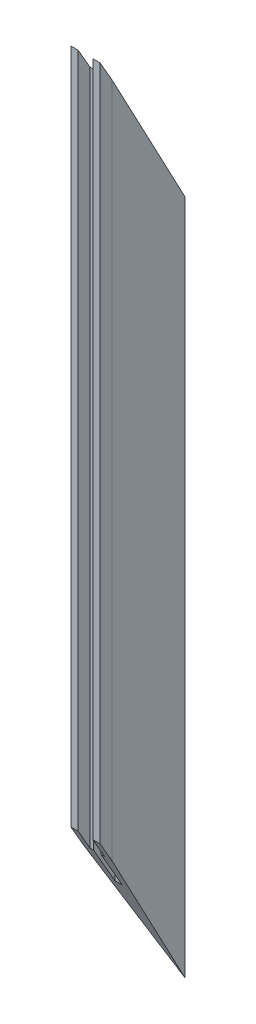
ISO-10303-21;
HEADER;
FILE_DESCRIPTION(('STEP AP214'),'2;1');
FILE_NAME('part.step','',(''),(''),'','','');
FILE_SCHEMA(('AUTOMOTIVE_DESIGN { 1 0 10303 214 1 1 1 1 }'));
ENDSEC;
DATA;
#1=APPLICATION_CONTEXT('core data for automotive mechanical design processes');
#2=APPLICATION_PROTOCOL_DEFINITION('international standard','automotive_design',2000,#1);
#3=PRODUCT_CONTEXT('',#1,'mechanical');
#4=PRODUCT('Part','Part','',(#3));
#5=PRODUCT_RELATED_PRODUCT_CATEGORY('part','',(#4));
#6=PRODUCT_DEFINITION_FORMATION('','',#4);
#7=PRODUCT_DEFINITION_CONTEXT('part definition',#1,'design');
#8=PRODUCT_DEFINITION('design','',#6,#7);
#9=PRODUCT_DEFINITION_SHAPE('','',#8);
#10=(LENGTH_UNIT() NAMED_UNIT(*) SI_UNIT(.MILLI.,.METRE.));
#11=(NAMED_UNIT(*) PLANE_ANGLE_UNIT() SI_UNIT($,.RADIAN.));
#12=(NAMED_UNIT(*) SI_UNIT($,.STERADIAN.) SOLID_ANGLE_UNIT());
#13=UNCERTAINTY_MEASURE_WITH_UNIT(LENGTH_MEASURE(1.E-05),#10,'distance_accuracy_value','');
#14=(GEOMETRIC_REPRESENTATION_CONTEXT(3) GLOBAL_UNCERTAINTY_ASSIGNED_CONTEXT((#13)) GLOBAL_UNIT_ASSIGNED_CONTEXT((#10,
#11,#12)) REPRESENTATION_CONTEXT('',''));
#15=CARTESIAN_POINT('',(0.,0.,0.));
#16=DIRECTION('',(0.,0.,1.));
#17=DIRECTION('',(1.,0.,0.));
#18=AXIS2_PLACEMENT_3D('',#15,#16,#17);
#19=CARTESIAN_POINT('',(0.,369.316,-38.1));
#20=DIRECTION('',(-0.986393923832144,0.,0.164398987305357));
#21=DIRECTION('',(0.164398987305357,0.,0.986393923832144));
#22=AXIS2_PLACEMENT_3D('',#19,#20,#21);
#23=PLANE('',#22);
#24=DIRECTION('',(0.,-1.,0.));
#25=VECTOR('',#24,1.);
#26=CARTESIAN_POINT('',(6.35,369.316,0.));
#27=LINE('',#26,#25);
#28=CARTESIAN_POINT('',(6.35,360.481609234908,0.));
#29=VERTEX_POINT('',#28);
#30=CARTESIAN_POINT('',(6.35,67.3656092349079,0.));
#31=VERTEX_POINT('',#30);
#32=EDGE_CURVE('E186',#29,#31,#27,.T.);
#33=ORIENTED_EDGE('',*,*,#32,.T.);
#34=DIRECTION('',(-0.0827960315270938,-0.863920271231371,-0.496776189162563));
#35=VECTOR('',#34,1.);
#36=CARTESIAN_POINT('',(26.3376356292924,275.9229914626,119.925813775755));
#37=LINE('',#36,#35);
#38=CARTESIAN_POINT('',(0.,1.10767849671754,-38.1));
#39=VERTEX_POINT('',#38);
#40=EDGE_CURVE('E60',#31,#39,#37,.T.);
#41=ORIENTED_EDGE('',*,*,#40,.T.);
#42=DIRECTION('',(0.,-1.,0.));
#43=VECTOR('',#42,1.);
#44=CARTESIAN_POINT('',(0.,369.316,-38.1));
#45=LINE('',#44,#43);
#46=CARTESIAN_POINT('',(0.,294.223678496717,-38.1));
#47=VERTEX_POINT('',#46);
#48=EDGE_CURVE('E53',#47,#39,#45,.T.);
#49=ORIENTED_EDGE('',*,*,#48,.F.);
#50=DIRECTION('',(0.0827960315270937,0.863920271231371,0.496776189162562));
#51=VECTOR('',#50,1.);
#52=CARTESIAN_POINT('',(5.37129143153682,350.269451039301,-5.87225141077907));
#53=LINE('',#52,#51);
#54=EDGE_CURVE('E184',#47,#29,#53,.T.);
#55=ORIENTED_EDGE('',*,*,#54,.T.);
#56=EDGE_LOOP('',(#33,#41,#49,#55));
#57=FACE_BOUND('',#56,.T.);
#58=ADVANCED_FACE('F45',(#57),#23,.F.);
#59=CARTESIAN_POINT('',(0.,369.316,-38.1));
#60=DIRECTION('',(0.986393923832144,0.,0.164398987305357));
#61=DIRECTION('',(0.164398987305357,0.,-0.986393923832144));
#62=AXIS2_PLACEMENT_3D('',#59,#60,#61);
#63=PLANE('',#62);
#64=ORIENTED_EDGE('',*,*,#48,.T.);
#65=DIRECTION('',(-0.0827960315270938,0.863920271231371,0.496776189162563));
#66=VECTOR('',#65,1.);
#67=CARTESIAN_POINT('',(-26.3376356292924,275.9229914626,119.925813775755));
#68=LINE('',#67,#66);
#69=CARTESIAN_POINT('',(-6.35,67.3656092349079,0.));
#70=VERTEX_POINT('',#69);
#71=EDGE_CURVE('E179',#39,#70,#68,.T.);
#72=ORIENTED_EDGE('',*,*,#71,.T.);
#73=DIRECTION('',(0.,-1.,0.));
#74=VECTOR('',#73,1.);
#75=CARTESIAN_POINT('',(-6.35,369.316,0.));
#76=LINE('',#75,#74);
#77=CARTESIAN_POINT('',(-6.35,360.481609234908,0.));
#78=VERTEX_POINT('',#77);
#79=EDGE_CURVE('E159',#78,#70,#76,.T.);
#80=ORIENTED_EDGE('',*,*,#79,.F.);
#81=DIRECTION('',(0.0827960315270937,-0.863920271231371,-0.496776189162562));
#82=VECTOR('',#81,1.);
#83=CARTESIAN_POINT('',(-5.37129143153682,350.269451039301,-5.87225141077907));
#84=LINE('',#83,#82);
#85=EDGE_CURVE('E180',#78,#47,#84,.T.);
#86=ORIENTED_EDGE('',*,*,#85,.T.);
#87=EDGE_LOOP('',(#64,#72,#80,#86));
#88=FACE_BOUND('',#87,.T.);
#89=ADVANCED_FACE('F178',(#88),#63,.F.);
#90=CARTESIAN_POINT('',(-6.35,369.316,5.08));
#91=DIRECTION('',(1.,0.,0.));
#92=DIRECTION('',(0.,0.,-1.));
#93=AXIS2_PLACEMENT_3D('',#90,#91,#92);
#94=PLANE('',#93);
#95=ORIENTED_EDGE('',*,*,#79,.T.);
#96=DIRECTION('',(0.,-0.866896748935602,-0.498487739753831));
#97=VECTOR('',#96,1.);
#98=CARTESIAN_POINT('',(-6.35,76.2,5.08));
#99=LINE('',#98,#97);
#100=CARTESIAN_POINT('',(-6.35,76.2,5.08));
#101=VERTEX_POINT('',#100);
#102=EDGE_CURVE('E140',#101,#70,#99,.T.);
#103=ORIENTED_EDGE('',*,*,#102,.F.);
#104=DIRECTION('',(0.,-1.,0.));
#105=VECTOR('',#104,1.);
#106=CARTESIAN_POINT('',(-6.35,369.316,5.08));
#107=LINE('',#106,#105);
#108=CARTESIAN_POINT('',(-6.35,369.316,5.08));
#109=VERTEX_POINT('',#108);
#110=EDGE_CURVE('E156',#109,#101,#107,.T.);
#111=ORIENTED_EDGE('',*,*,#110,.F.);
#112=DIRECTION('',(0.,0.866896748935602,0.498487739753831));
#113=VECTOR('',#112,1.);
#114=CARTESIAN_POINT('',(-6.35,369.316,5.08));
#115=LINE('',#114,#113);
#116=EDGE_CURVE('E219',#78,#109,#115,.T.);
#117=ORIENTED_EDGE('',*,*,#116,.F.);
#118=EDGE_LOOP('',(#95,#103,#111,#117));
#119=FACE_BOUND('',#118,.T.);
#120=ADVANCED_FACE('F154',(#119),#94,.F.);
#121=CARTESIAN_POINT('',(-3.175,369.316,5.08));
#122=DIRECTION('',(0.,0.,-1.));
#123=DIRECTION('',(-1.,0.,0.));
#124=AXIS2_PLACEMENT_3D('',#121,#122,#123);
#125=PLANE('',#124);
#126=ORIENTED_EDGE('',*,*,#110,.T.);
#127=DIRECTION('',(-1.,0.,0.));
#128=VECTOR('',#127,1.);
#129=CARTESIAN_POINT('',(11.176,76.2,5.08));
#130=LINE('',#129,#128);
#131=CARTESIAN_POINT('',(-3.175,76.2,5.08));
#132=VERTEX_POINT('',#131);
#133=EDGE_CURVE('E137',#132,#101,#130,.T.);
#134=ORIENTED_EDGE('',*,*,#133,.F.);
#135=DIRECTION('',(0.,-1.,0.));
#136=VECTOR('',#135,1.);
#137=CARTESIAN_POINT('',(-3.175,369.316,5.08));
#138=LINE('',#137,#136);
#139=CARTESIAN_POINT('',(-3.175,369.316,5.08));
#140=VERTEX_POINT('',#139);
#141=EDGE_CURVE('E165',#140,#132,#138,.T.);
#142=ORIENTED_EDGE('',*,*,#141,.F.);
#143=DIRECTION('',(1.,0.,0.));
#144=VECTOR('',#143,1.);
#145=CARTESIAN_POINT('',(-3.175,369.316,5.08));
#146=LINE('',#145,#144);
#147=EDGE_CURVE('E163',#109,#140,#146,.T.);
#148=ORIENTED_EDGE('',*,*,#147,.F.);
#149=EDGE_LOOP('',(#126,#134,#142,#148));
#150=FACE_BOUND('',#149,.T.);
#151=ADVANCED_FACE('F162',(#150),#125,.F.);
#152=CARTESIAN_POINT('',(-3.175,369.316,0.));
#153=DIRECTION('',(-1.,0.,0.));
#154=DIRECTION('',(0.,0.,1.));
#155=AXIS2_PLACEMENT_3D('',#152,#153,#154);
#156=PLANE('',#155);
#157=ORIENTED_EDGE('',*,*,#141,.T.);
#158=DIRECTION('',(0.,-0.866896748935602,-0.498487739753831));
#159=VECTOR('',#158,1.);
#160=CARTESIAN_POINT('',(-3.17499999999998,294.284339341271,130.484057089172));
#161=LINE('',#160,#159);
#162=CARTESIAN_POINT('',(-3.175,67.365609234908,0.));
#163=VERTEX_POINT('',#162);
#164=EDGE_CURVE('E143',#132,#163,#161,.T.);
#165=ORIENTED_EDGE('',*,*,#164,.T.);
#166=DIRECTION('',(0.,-1.,0.));
#167=VECTOR('',#166,1.);
#168=CARTESIAN_POINT('',(-3.175,369.316,0.));
#169=LINE('',#168,#167);
#170=CARTESIAN_POINT('',(-3.175,360.481609234908,0.));
#171=VERTEX_POINT('',#170);
#172=EDGE_CURVE('E170',#171,#163,#169,.T.);
#173=ORIENTED_EDGE('',*,*,#172,.F.);
#174=DIRECTION('',(0.,0.866896748935602,0.498487739753831));
#175=VECTOR('',#174,1.);
#176=CARTESIAN_POINT('',(-3.175,367.120742003038,3.81767066444079));
#177=LINE('',#176,#175);
#178=EDGE_CURVE('E252',#171,#140,#177,.T.);
#179=ORIENTED_EDGE('',*,*,#178,.T.);
#180=EDGE_LOOP('',(#157,#165,#173,#179));
#181=FACE_BOUND('',#180,.T.);
#182=ADVANCED_FACE('F297',(#181),#156,.F.);
#183=CARTESIAN_POINT('',(-3.175,369.316,0.));
#184=DIRECTION('',(0.,0.,-1.));
#185=DIRECTION('',(-1.,0.,0.));
#186=AXIS2_PLACEMENT_3D('',#183,#184,#185);
#187=PLANE('',#186);
#188=ORIENTED_EDGE('',*,*,#172,.T.);
#189=DIRECTION('',(1.,0.,0.));
#190=VECTOR('',#189,1.);
#191=CARTESIAN_POINT('',(-3.17500000000013,67.365609234908,0.));
#192=LINE('',#191,#190);
#193=CARTESIAN_POINT('',(-1.5875,67.3656092349079,0.));
#194=VERTEX_POINT('',#193);
#195=EDGE_CURVE('E213',#163,#194,#192,.T.);
#196=ORIENTED_EDGE('',*,*,#195,.T.);
#197=DIRECTION('',(0.,-1.,0.));
#198=VECTOR('',#197,1.);
#199=CARTESIAN_POINT('',(-1.5875,369.316,0.));
#200=LINE('',#199,#198);
#201=CARTESIAN_POINT('',(-1.5875,360.481609234908,0.));
#202=VERTEX_POINT('',#201);
#203=EDGE_CURVE('E287',#202,#194,#200,.T.);
#204=ORIENTED_EDGE('',*,*,#203,.F.);
#205=DIRECTION('',(-1.,0.,0.));
#206=VECTOR('',#205,1.);
#207=CARTESIAN_POINT('',(-3.175,360.481609234908,0.));
#208=LINE('',#207,#206);
#209=EDGE_CURVE('E248',#202,#171,#208,.T.);
#210=ORIENTED_EDGE('',*,*,#209,.T.);
#211=EDGE_LOOP('',(#188,#196,#204,#210));
#212=FACE_BOUND('',#211,.T.);
#213=ADVANCED_FACE('F294',(#212),#187,.F.);
#214=CARTESIAN_POINT('',(-1.5875,369.316,0.));
#215=DIRECTION('',(-1.,0.,0.));
#216=DIRECTION('',(0.,0.,1.));
#217=AXIS2_PLACEMENT_3D('',#214,#215,#216);
#218=PLANE('',#217);
#219=ORIENTED_EDGE('',*,*,#203,.T.);
#220=DIRECTION('',(0.,-0.866896748935602,-0.498487739753831));
#221=VECTOR('',#220,1.);
#222=CARTESIAN_POINT('',(-1.5875,294.284339341271,130.484057089172));
#223=LINE('',#222,#221);
#224=CARTESIAN_POINT('',(-1.5875,51.2580993837117,-9.26222896630315));
#225=VERTEX_POINT('',#224);
#226=EDGE_CURVE('E209',#194,#225,#223,.T.);
#227=ORIENTED_EDGE('',*,*,#226,.T.);
#228=DIRECTION('',(0.,-1.,0.));
#229=VECTOR('',#228,1.);
#230=CARTESIAN_POINT('',(-1.5875,369.316,-9.26222896630315));
#231=LINE('',#230,#229);
#232=CARTESIAN_POINT('',(-1.5875,344.374099383712,-9.26222896630315));
#233=VERTEX_POINT('',#232);
#234=EDGE_CURVE('E283',#233,#225,#231,.T.);
#235=ORIENTED_EDGE('',*,*,#234,.F.);
#236=DIRECTION('',(0.,0.866896748935602,0.498487739753831));
#237=VECTOR('',#236,1.);
#238=CARTESIAN_POINT('',(-1.5875,367.120742003038,3.81767066444079));
#239=LINE('',#238,#237);
#240=EDGE_CURVE('E244',#233,#202,#239,.T.);
#241=ORIENTED_EDGE('',*,*,#240,.T.);
#242=EDGE_LOOP('',(#219,#227,#235,#241));
#243=FACE_BOUND('',#242,.T.);
#244=ADVANCED_FACE('F319',(#243),#218,.F.);
#245=CARTESIAN_POINT('',(-1.5875,369.316,-9.26222896630315));
#246=DIRECTION('',(0.,0.,-1.));
#247=DIRECTION('',(-1.,0.,0.));
#248=AXIS2_PLACEMENT_3D('',#245,#246,#247);
#249=PLANE('',#248);
#250=ORIENTED_EDGE('',*,*,#234,.T.);
#251=DIRECTION('',(1.,0.,0.));
#252=VECTOR('',#251,1.);
#253=CARTESIAN_POINT('',(-1.5874999999997,51.2580993837117,-9.26222896630315));
#254=LINE('',#253,#252);
#255=CARTESIAN_POINT('',(1.5875,51.2580993837117,-9.26222896630316));
#256=VERTEX_POINT('',#255);
#257=EDGE_CURVE('E205',#225,#256,#254,.T.);
#258=ORIENTED_EDGE('',*,*,#257,.T.);
#259=DIRECTION('',(0.,-1.,0.));
#260=VECTOR('',#259,1.);
#261=CARTESIAN_POINT('',(1.5875,369.316,-9.26222896630315));
#262=LINE('',#261,#260);
#263=CARTESIAN_POINT('',(1.5875,344.374099383712,-9.26222896630315));
#264=VERTEX_POINT('',#263);
#265=EDGE_CURVE('E279',#264,#256,#262,.T.);
#266=ORIENTED_EDGE('',*,*,#265,.F.);
#267=DIRECTION('',(-1.,0.,0.));
#268=VECTOR('',#267,1.);
#269=CARTESIAN_POINT('',(-1.58749999999998,344.374099383712,-9.26222896630315));
#270=LINE('',#269,#268);
#271=EDGE_CURVE('E240',#264,#233,#270,.T.);
#272=ORIENTED_EDGE('',*,*,#271,.T.);
#273=EDGE_LOOP('',(#250,#258,#266,#272));
#274=FACE_BOUND('',#273,.T.);
#275=ADVANCED_FACE('F316',(#274),#249,.F.);
#276=CARTESIAN_POINT('',(1.5875,369.316,-9.26222896630315));
#277=DIRECTION('',(1.,0.,0.));
#278=DIRECTION('',(0.,0.,-1.));
#279=AXIS2_PLACEMENT_3D('',#276,#277,#278);
#280=PLANE('',#279);
#281=ORIENTED_EDGE('',*,*,#265,.T.);
#282=DIRECTION('',(0.,0.866896748935602,0.498487739753831));
#283=VECTOR('',#282,1.);
#284=CARTESIAN_POINT('',(1.58750000000002,290.28178378852,128.182485566174));
#285=LINE('',#284,#283);
#286=CARTESIAN_POINT('',(1.5875,67.365609234908,0.));
#287=VERTEX_POINT('',#286);
#288=EDGE_CURVE('E201',#256,#287,#285,.T.);
#289=ORIENTED_EDGE('',*,*,#288,.T.);
#290=DIRECTION('',(0.,-1.,0.));
#291=VECTOR('',#290,1.);
#292=CARTESIAN_POINT('',(1.5875,369.316,0.));
#293=LINE('',#292,#291);
#294=CARTESIAN_POINT('',(1.5875,360.481609234908,0.));
#295=VERTEX_POINT('',#294);
#296=EDGE_CURVE('E275',#295,#287,#293,.T.);
#297=ORIENTED_EDGE('',*,*,#296,.F.);
#298=DIRECTION('',(0.,-0.866896748935602,-0.498487739753831));
#299=VECTOR('',#298,1.);
#300=CARTESIAN_POINT('',(1.5875,363.118186450287,1.51609914144262));
#301=LINE('',#300,#299);
#302=EDGE_CURVE('E236',#295,#264,#301,.T.);
#303=ORIENTED_EDGE('',*,*,#302,.T.);
#304=EDGE_LOOP('',(#281,#289,#297,#303));
#305=FACE_BOUND('',#304,.T.);
#306=ADVANCED_FACE('F313',(#305),#280,.F.);
#307=CARTESIAN_POINT('',(1.5875,369.316,0.));
#308=DIRECTION('',(0.,0.,-1.));
#309=DIRECTION('',(-1.,0.,0.));
#310=AXIS2_PLACEMENT_3D('',#307,#308,#309);
#311=PLANE('',#310);
#312=ORIENTED_EDGE('',*,*,#296,.T.);
#313=DIRECTION('',(1.,0.,0.));
#314=VECTOR('',#313,1.);
#315=CARTESIAN_POINT('',(1.5875,67.365609234908,0.));
#316=LINE('',#315,#314);
#317=CARTESIAN_POINT('',(3.175,67.365609234908,0.));
#318=VERTEX_POINT('',#317);
#319=EDGE_CURVE('E197',#287,#318,#316,.T.);
#320=ORIENTED_EDGE('',*,*,#319,.T.);
#321=DIRECTION('',(0.,-1.,0.));
#322=VECTOR('',#321,1.);
#323=CARTESIAN_POINT('',(3.175,369.316,0.));
#324=LINE('',#323,#322);
#325=CARTESIAN_POINT('',(3.175,360.481609234908,0.));
#326=VERTEX_POINT('',#325);
#327=EDGE_CURVE('E271',#326,#318,#324,.T.);
#328=ORIENTED_EDGE('',*,*,#327,.F.);
#329=DIRECTION('',(-1.,0.,0.));
#330=VECTOR('',#329,1.);
#331=CARTESIAN_POINT('',(1.5875,360.481609234908,0.));
#332=LINE('',#331,#330);
#333=EDGE_CURVE('E232',#326,#295,#332,.T.);
#334=ORIENTED_EDGE('',*,*,#333,.T.);
#335=EDGE_LOOP('',(#312,#320,#328,#334));
#336=FACE_BOUND('',#335,.T.);
#337=ADVANCED_FACE('F310',(#336),#311,.F.);
#338=CARTESIAN_POINT('',(3.175,369.316,0.));
#339=DIRECTION('',(1.,0.,0.));
#340=DIRECTION('',(0.,0.,-1.));
#341=AXIS2_PLACEMENT_3D('',#338,#339,#340);
#342=PLANE('',#341);
#343=ORIENTED_EDGE('',*,*,#327,.T.);
#344=DIRECTION('',(0.,0.866896748935602,0.498487739753831));
#345=VECTOR('',#344,1.);
#346=CARTESIAN_POINT('',(3.175,294.284339341271,130.484057089172));
#347=LINE('',#346,#345);
#348=CARTESIAN_POINT('',(3.175,76.2,5.08));
#349=VERTEX_POINT('',#348);
#350=EDGE_CURVE('E191',#318,#349,#347,.T.);
#351=ORIENTED_EDGE('',*,*,#350,.T.);
#352=DIRECTION('',(0.,-1.,0.));
#353=VECTOR('',#352,1.);
#354=CARTESIAN_POINT('',(3.175,369.316,5.08));
#355=LINE('',#354,#353);
#356=CARTESIAN_POINT('',(3.175,369.316,5.08));
#357=VERTEX_POINT('',#356);
#358=EDGE_CURVE('E267',#357,#349,#355,.T.);
#359=ORIENTED_EDGE('',*,*,#358,.F.);
#360=DIRECTION('',(0.,-0.866896748935602,-0.498487739753831));
#361=VECTOR('',#360,1.);
#362=CARTESIAN_POINT('',(3.175,367.120742003038,3.81767066444079));
#363=LINE('',#362,#361);
#364=EDGE_CURVE('E67',#357,#326,#363,.T.);
#365=ORIENTED_EDGE('',*,*,#364,.T.);
#366=EDGE_LOOP('',(#343,#351,#359,#365));
#367=FACE_BOUND('',#366,.T.);
#368=ADVANCED_FACE('F307',(#367),#342,.F.);
#369=CARTESIAN_POINT('',(3.175,369.316,5.08));
#370=DIRECTION('',(0.,0.,-1.));
#371=DIRECTION('',(-1.,0.,0.));
#372=AXIS2_PLACEMENT_3D('',#369,#370,#371);
#373=PLANE('',#372);
#374=ORIENTED_EDGE('',*,*,#358,.T.);
#375=CARTESIAN_POINT('',(6.35,76.2,5.08));
#376=VERTEX_POINT('',#375);
#377=EDGE_CURVE('E149',#376,#349,#130,.T.);
#378=ORIENTED_EDGE('',*,*,#377,.F.);
#379=DIRECTION('',(0.,-1.,0.));
#380=VECTOR('',#379,1.);
#381=CARTESIAN_POINT('',(6.35,369.316,5.08));
#382=LINE('',#381,#380);
#383=CARTESIAN_POINT('',(6.35,369.316,5.08));
#384=VERTEX_POINT('',#383);
#385=EDGE_CURVE('E263',#384,#376,#382,.T.);
#386=ORIENTED_EDGE('',*,*,#385,.F.);
#387=DIRECTION('',(1.,0.,0.));
#388=VECTOR('',#387,1.);
#389=CARTESIAN_POINT('',(3.175,369.316,5.08));
#390=LINE('',#389,#388);
#391=EDGE_CURVE('E258',#357,#384,#390,.T.);
#392=ORIENTED_EDGE('',*,*,#391,.F.);
#393=EDGE_LOOP('',(#374,#378,#386,#392));
#394=FACE_BOUND('',#393,.T.);
#395=ADVANCED_FACE('F305',(#394),#373,.F.);
#396=CARTESIAN_POINT('',(6.35,369.316,5.08));
#397=DIRECTION('',(-1.,0.,0.));
#398=DIRECTION('',(0.,0.,1.));
#399=AXIS2_PLACEMENT_3D('',#396,#397,#398);
#400=PLANE('',#399);
#401=ORIENTED_EDGE('',*,*,#385,.T.);
#402=DIRECTION('',(0.,-0.866896748935602,-0.498487739753831));
#403=VECTOR('',#402,1.);
#404=CARTESIAN_POINT('',(6.35,296.479597338234,131.746386424731));
#405=LINE('',#404,#403);
#406=EDGE_CURVE('E11',#376,#31,#405,.T.);
#407=ORIENTED_EDGE('',*,*,#406,.T.);
#408=ORIENTED_EDGE('',*,*,#32,.F.);
#409=DIRECTION('',(0.,0.866896748935602,0.498487739753831));
#410=VECTOR('',#409,1.);
#411=CARTESIAN_POINT('',(6.35,369.316,5.08));
#412=LINE('',#411,#410);
#413=EDGE_CURVE('E222',#29,#384,#412,.T.);
#414=ORIENTED_EDGE('',*,*,#413,.T.);
#415=EDGE_LOOP('',(#401,#407,#408,#414));
#416=FACE_BOUND('',#415,.T.);
#417=ADVANCED_FACE('F302',(#416),#400,.F.);
#418=CARTESIAN_POINT('',(11.176,369.316,5.08));
#419=DIRECTION('',(0.,-0.498487739753831,0.866896748935602));
#420=DIRECTION('',(0.,-0.866896748935602,-0.498487739753831));
#421=AXIS2_PLACEMENT_3D('',#418,#419,#420);
#422=PLANE('',#421);
#423=ORIENTED_EDGE('',*,*,#209,.F.);
#424=ORIENTED_EDGE('',*,*,#240,.F.);
#425=ORIENTED_EDGE('',*,*,#271,.F.);
#426=ORIENTED_EDGE('',*,*,#302,.F.);
#427=ORIENTED_EDGE('',*,*,#333,.F.);
#428=ORIENTED_EDGE('',*,*,#364,.F.);
#429=ORIENTED_EDGE('',*,*,#391,.T.);
#430=ORIENTED_EDGE('',*,*,#413,.F.);
#431=ORIENTED_EDGE('',*,*,#54,.F.);
#432=ORIENTED_EDGE('',*,*,#85,.F.);
#433=ORIENTED_EDGE('',*,*,#116,.T.);
#434=ORIENTED_EDGE('',*,*,#147,.T.);
#435=ORIENTED_EDGE('',*,*,#178,.F.);
#436=EDGE_LOOP('',(#423,#424,#425,#426,#427,#428,#429,#430,#431,#432,#433,#434,#435));
#437=FACE_BOUND('',#436,.T.);
#438=ADVANCED_FACE('F298',(#437),#422,.F.);
#439=CARTESIAN_POINT('',(11.176,76.2,5.08));
#440=DIRECTION('',(0.,0.498487739753831,-0.866896748935602));
#441=DIRECTION('',(0.,0.866896748935602,0.498487739753831));
#442=AXIS2_PLACEMENT_3D('',#439,#440,#441);
#443=PLANE('',#442);
#444=ORIENTED_EDGE('',*,*,#133,.T.);
#445=ORIENTED_EDGE('',*,*,#102,.T.);
#446=ORIENTED_EDGE('',*,*,#71,.F.);
#447=ORIENTED_EDGE('',*,*,#40,.F.);
#448=ORIENTED_EDGE('',*,*,#406,.F.);
#449=ORIENTED_EDGE('',*,*,#377,.T.);
#450=ORIENTED_EDGE('',*,*,#350,.F.);
#451=ORIENTED_EDGE('',*,*,#319,.F.);
#452=ORIENTED_EDGE('',*,*,#288,.F.);
#453=ORIENTED_EDGE('',*,*,#257,.F.);
#454=ORIENTED_EDGE('',*,*,#226,.F.);
#455=ORIENTED_EDGE('',*,*,#195,.F.);
#456=ORIENTED_EDGE('',*,*,#164,.F.);
#457=EDGE_LOOP('',(#444,#445,#446,#447,#448,#449,#450,#451,#452,#453,#454,#455,#456));
#458=FACE_BOUND('',#457,.T.);
#459=ADVANCED_FACE('F139',(#458),#443,.F.);
#460=CLOSED_SHELL('',(#58,#89,#120,#151,#182,#213,#244,#275,#306,#337,#368,#395,#417,#438,#459));
#461=MANIFOLD_SOLID_BREP('B2',#460);
#462=ADVANCED_BREP_SHAPE_REPRESENTATION('',(#18,#461),#14);
#463=SHAPE_DEFINITION_REPRESENTATION(#9,#462);
ENDSEC;
END-ISO-10303-21;
